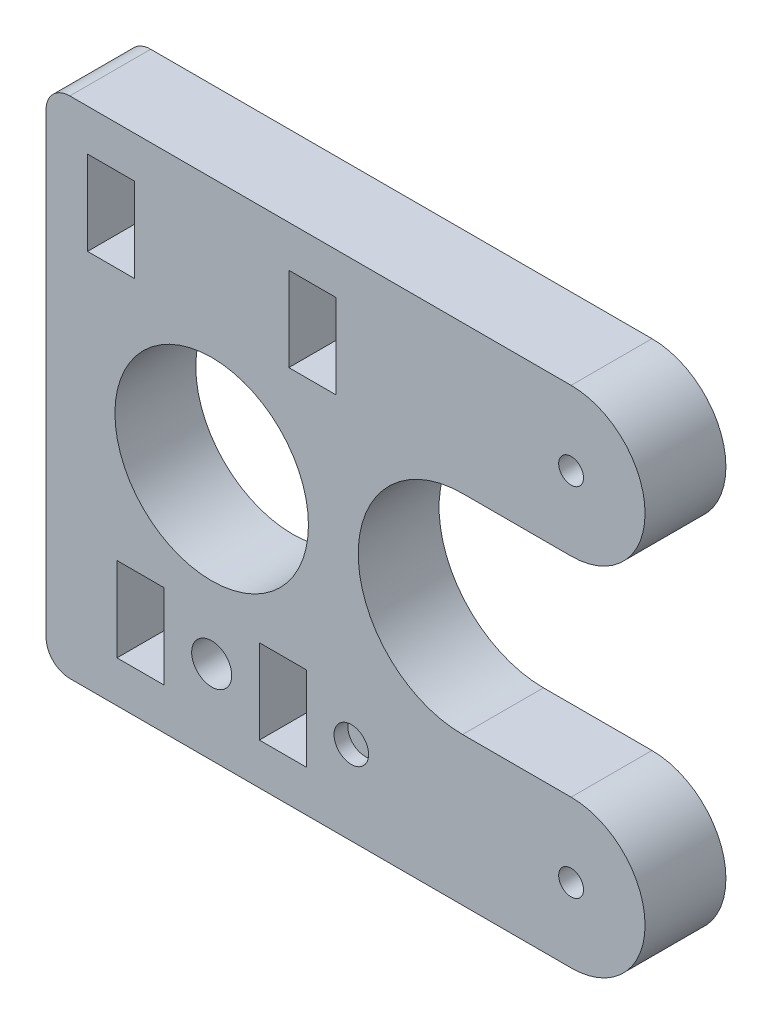
ISO-10303-21;
HEADER;
FILE_DESCRIPTION(('STEP AP214'),'2;1');
FILE_NAME('part.step','',(''),(''),'','','');
FILE_SCHEMA(('AUTOMOTIVE_DESIGN { 1 0 10303 214 1 1 1 1 }'));
ENDSEC;
DATA;
#1=APPLICATION_CONTEXT('core data for automotive mechanical design processes');
#2=APPLICATION_PROTOCOL_DEFINITION('international standard','automotive_design',2000,#1);
#3=PRODUCT_CONTEXT('',#1,'mechanical');
#4=PRODUCT('Part','Part','',(#3));
#5=PRODUCT_RELATED_PRODUCT_CATEGORY('part','',(#4));
#6=PRODUCT_DEFINITION_FORMATION('','',#4);
#7=PRODUCT_DEFINITION_CONTEXT('part definition',#1,'design');
#8=PRODUCT_DEFINITION('design','',#6,#7);
#9=PRODUCT_DEFINITION_SHAPE('','',#8);
#10=(LENGTH_UNIT() NAMED_UNIT(*) SI_UNIT(.MILLI.,.METRE.));
#11=(NAMED_UNIT(*) PLANE_ANGLE_UNIT() SI_UNIT($,.RADIAN.));
#12=(NAMED_UNIT(*) SI_UNIT($,.STERADIAN.) SOLID_ANGLE_UNIT());
#13=UNCERTAINTY_MEASURE_WITH_UNIT(LENGTH_MEASURE(1.E-05),#10,'distance_accuracy_value','');
#14=(GEOMETRIC_REPRESENTATION_CONTEXT(3) GLOBAL_UNCERTAINTY_ASSIGNED_CONTEXT((#13)) GLOBAL_UNIT_ASSIGNED_CONTEXT((#10,
#11,#12)) REPRESENTATION_CONTEXT('',''));
#15=CARTESIAN_POINT('',(0.,0.,0.));
#16=DIRECTION('',(0.,0.,1.));
#17=DIRECTION('',(1.,0.,0.));
#18=AXIS2_PLACEMENT_3D('',#15,#16,#17);
#19=CARTESIAN_POINT('',(684.72652137136,317.86545660983,5.85));
#20=DIRECTION('',(0.,0.,1.));
#21=DIRECTION('',(1.,0.,0.));
#22=AXIS2_PLACEMENT_3D('',#19,#20,#21);
#23=PLANE('',#22);
#24=CARTESIAN_POINT('',(668.82652137136,318.56545660983,5.85));
#25=DIRECTION('',(0.,0.,1.));
#26=DIRECTION('',(1.,0.,0.));
#27=AXIS2_PLACEMENT_3D('',#24,#25,#26);
#28=CIRCLE('',#27,1.24999999999996);
#29=CARTESIAN_POINT('',(670.07652137136,318.56545660983,5.85));
#30=VERTEX_POINT('',#29);
#31=EDGE_CURVE('E801',#30,#30,#28,.T.);
#32=ORIENTED_EDGE('',*,*,#31,.F.);
#33=EDGE_LOOP('',(#32));
#34=FACE_BOUND('',#33,.T.);
#35=DIRECTION('',(0.,1.,0.));
#36=VECTOR('',#35,1.);
#37=CARTESIAN_POINT('',(667.70653237136,339.91545660983,5.85));
#38=LINE('',#37,#36);
#39=CARTESIAN_POINT('',(667.70653237136,339.91545660983,5.85));
#40=VERTEX_POINT('',#39);
#41=CARTESIAN_POINT('',(667.70653237136,346.01545660983,5.85));
#42=VERTEX_POINT('',#41);
#43=EDGE_CURVE('E248',#40,#42,#38,.T.);
#44=ORIENTED_EDGE('',*,*,#43,.F.);
#45=DIRECTION('',(1.,0.,0.));
#46=VECTOR('',#45,1.);
#47=CARTESIAN_POINT('',(664.30652137136,339.91545660983,5.85));
#48=LINE('',#47,#46);
#49=CARTESIAN_POINT('',(664.30652137136,339.91545660983,5.85));
#50=VERTEX_POINT('',#49);
#51=EDGE_CURVE('E246',#50,#40,#48,.T.);
#52=ORIENTED_EDGE('',*,*,#51,.F.);
#53=DIRECTION('',(0.,-1.,0.));
#54=VECTOR('',#53,1.);
#55=CARTESIAN_POINT('',(664.30652137136,346.01545660983,5.85));
#56=LINE('',#55,#54);
#57=CARTESIAN_POINT('',(664.30652137136,346.01545660983,5.85));
#58=VERTEX_POINT('',#57);
#59=EDGE_CURVE('E254',#58,#50,#56,.T.);
#60=ORIENTED_EDGE('',*,*,#59,.F.);
#61=DIRECTION('',(-1.,0.,0.));
#62=VECTOR('',#61,1.);
#63=CARTESIAN_POINT('',(667.70653237136,346.01545660983,5.85));
#64=LINE('',#63,#62);
#65=EDGE_CURVE('E251',#42,#58,#64,.T.);
#66=ORIENTED_EDGE('',*,*,#65,.F.);
#67=EDGE_LOOP('',(#44,#52,#60,#66));
#68=FACE_BOUND('',#67,.T.);
#69=DIRECTION('',(0.,1.,0.));
#70=VECTOR('',#69,1.);
#71=CARTESIAN_POINT('',(653.14652137136,339.91545660983,5.85));
#72=LINE('',#71,#70);
#73=CARTESIAN_POINT('',(653.14652137136,339.91545660983,5.85));
#74=VERTEX_POINT('',#73);
#75=CARTESIAN_POINT('',(653.14652137136,346.01545660983,5.85));
#76=VERTEX_POINT('',#75);
#77=EDGE_CURVE('E310',#74,#76,#72,.T.);
#78=ORIENTED_EDGE('',*,*,#77,.F.);
#79=DIRECTION('',(1.,0.,0.));
#80=VECTOR('',#79,1.);
#81=CARTESIAN_POINT('',(649.74651037136,339.91545660983,5.85));
#82=LINE('',#81,#80);
#83=CARTESIAN_POINT('',(649.74651037136,339.91545660983,5.85));
#84=VERTEX_POINT('',#83);
#85=EDGE_CURVE('E308',#84,#74,#82,.T.);
#86=ORIENTED_EDGE('',*,*,#85,.F.);
#87=DIRECTION('',(0.,-1.,0.));
#88=VECTOR('',#87,1.);
#89=CARTESIAN_POINT('',(649.74651037136,346.01545660983,5.85));
#90=LINE('',#89,#88);
#91=CARTESIAN_POINT('',(649.74651037136,346.01545660983,5.85));
#92=VERTEX_POINT('',#91);
#93=EDGE_CURVE('E316',#92,#84,#90,.T.);
#94=ORIENTED_EDGE('',*,*,#93,.F.);
#95=DIRECTION('',(-1.,0.,0.));
#96=VECTOR('',#95,1.);
#97=CARTESIAN_POINT('',(653.14652137136,346.01545660983,5.85));
#98=LINE('',#97,#96);
#99=EDGE_CURVE('E313',#76,#92,#98,.T.);
#100=ORIENTED_EDGE('',*,*,#99,.F.);
#101=EDGE_LOOP('',(#78,#86,#94,#100));
#102=FACE_BOUND('',#101,.T.);
#103=CARTESIAN_POINT('',(658.72652137136,330.76545660983,5.85));
#104=DIRECTION('',(0.,0.,1.));
#105=DIRECTION('',(1.,0.,0.));
#106=AXIS2_PLACEMENT_3D('',#103,#104,#105);
#107=CIRCLE('',#106,7.00000000000004);
#108=CARTESIAN_POINT('',(665.72652137136,330.76545660983,5.85));
#109=VERTEX_POINT('',#108);
#110=EDGE_CURVE('E345',#109,#109,#107,.T.);
#111=ORIENTED_EDGE('',*,*,#110,.F.);
#112=EDGE_LOOP('',(#111));
#113=FACE_BOUND('',#112,.T.);
#114=CARTESIAN_POINT('',(684.72652137136,343.66545660983,5.85));
#115=DIRECTION('',(0.,0.,1.));
#116=DIRECTION('',(1.,0.,0.));
#117=AXIS2_PLACEMENT_3D('',#114,#115,#116);
#118=CIRCLE('',#117,0.900000000000007);
#119=CARTESIAN_POINT('',(685.62652137136,343.66545660983,5.85));
#120=VERTEX_POINT('',#119);
#121=EDGE_CURVE('E357',#120,#120,#118,.T.);
#122=ORIENTED_EDGE('',*,*,#121,.F.);
#123=EDGE_LOOP('',(#122));
#124=FACE_BOUND('',#123,.T.);
#125=DIRECTION('',(1.,0.,0.));
#126=VECTOR('',#125,1.);
#127=CARTESIAN_POINT('',(669.216844170212,312.51545660983,5.85));
#128=LINE('',#127,#126);
#129=CARTESIAN_POINT('',(648.463811899796,312.51545660983,5.85));
#130=VERTEX_POINT('',#129);
#131=CARTESIAN_POINT('',(684.726521371375,312.51545660983,5.85));
#132=VERTEX_POINT('',#131);
#133=EDGE_CURVE('E363',#130,#132,#128,.T.);
#134=ORIENTED_EDGE('',*,*,#133,.T.);
#135=CARTESIAN_POINT('',(684.72652137136,317.86545660983,5.85));
#136=DIRECTION('',(0.,0.,1.));
#137=DIRECTION('',(1.,0.,0.));
#138=AXIS2_PLACEMENT_3D('',#135,#136,#137);
#139=CIRCLE('',#138,5.34999999999997);
#140=CARTESIAN_POINT('',(684.726521371376,323.21545660983,5.85));
#141=VERTEX_POINT('',#140);
#142=EDGE_CURVE('E366',#132,#141,#139,.T.);
#143=ORIENTED_EDGE('',*,*,#142,.T.);
#144=DIRECTION('',(-1.,0.,0.));
#145=VECTOR('',#144,1.);
#146=CARTESIAN_POINT('',(684.726521371376,323.21545660983,5.85));
#147=LINE('',#146,#145);
#148=CARTESIAN_POINT('',(676.876521371359,323.21545660983,5.85));
#149=VERTEX_POINT('',#148);
#150=EDGE_CURVE('E369',#141,#149,#147,.T.);
#151=ORIENTED_EDGE('',*,*,#150,.T.);
#152=CARTESIAN_POINT('',(676.876521371359,330.76545660983,5.85));
#153=DIRECTION('',(0.,0.,-1.));
#154=DIRECTION('',(1.,0.,0.));
#155=AXIS2_PLACEMENT_3D('',#152,#153,#154);
#156=CIRCLE('',#155,7.55);
#157=CARTESIAN_POINT('',(676.876521371359,338.31545660983,5.85));
#158=VERTEX_POINT('',#157);
#159=EDGE_CURVE('E371',#149,#158,#156,.T.);
#160=ORIENTED_EDGE('',*,*,#159,.T.);
#161=DIRECTION('',(1.,0.,0.));
#162=VECTOR('',#161,1.);
#163=CARTESIAN_POINT('',(684.726521371376,338.31545660983,5.85));
#164=LINE('',#163,#162);
#165=CARTESIAN_POINT('',(684.726521371376,338.31545660983,5.85));
#166=VERTEX_POINT('',#165);
#167=EDGE_CURVE('E373',#158,#166,#164,.T.);
#168=ORIENTED_EDGE('',*,*,#167,.T.);
#169=CARTESIAN_POINT('',(684.72652137136,343.66545660983,5.85));
#170=DIRECTION('',(0.,0.,1.));
#171=DIRECTION('',(-1.,0.,0.));
#172=AXIS2_PLACEMENT_3D('',#169,#170,#171);
#173=CIRCLE('',#172,5.34999999999997);
#174=CARTESIAN_POINT('',(684.726521371375,349.01545660983,5.85));
#175=VERTEX_POINT('',#174);
#176=EDGE_CURVE('E375',#166,#175,#173,.T.);
#177=ORIENTED_EDGE('',*,*,#176,.T.);
#178=DIRECTION('',(-1.,0.,0.));
#179=VECTOR('',#178,1.);
#180=CARTESIAN_POINT('',(669.21684417021,349.01545660983,5.85));
#181=LINE('',#180,#179);
#182=CARTESIAN_POINT('',(648.463811899796,349.01545660983,5.85));
#183=VERTEX_POINT('',#182);
#184=EDGE_CURVE('E377',#175,#183,#181,.T.);
#185=ORIENTED_EDGE('',*,*,#184,.T.);
#186=CARTESIAN_POINT('',(648.463811899796,347.298155081394,5.85));
#187=DIRECTION('',(0.,0.,1.));
#188=DIRECTION('',(1.,0.,0.));
#189=AXIS2_PLACEMENT_3D('',#186,#187,#188);
#190=CIRCLE('',#189,1.71730152843574);
#191=CARTESIAN_POINT('',(646.74651037136,347.298155081394,5.85));
#192=VERTEX_POINT('',#191);
#193=EDGE_CURVE('E379',#183,#192,#190,.T.);
#194=ORIENTED_EDGE('',*,*,#193,.T.);
#195=DIRECTION('',(0.,-1.,0.));
#196=VECTOR('',#195,1.);
#197=CARTESIAN_POINT('',(646.74651037136,347.298155081394,5.85));
#198=LINE('',#197,#196);
#199=CARTESIAN_POINT('',(646.74651037136,314.232758138266,5.85));
#200=VERTEX_POINT('',#199);
#201=EDGE_CURVE('E381',#192,#200,#198,.T.);
#202=ORIENTED_EDGE('',*,*,#201,.T.);
#203=CARTESIAN_POINT('',(648.463811899796,314.232758138266,5.85));
#204=DIRECTION('',(0.,0.,1.));
#205=DIRECTION('',(1.,0.,0.));
#206=AXIS2_PLACEMENT_3D('',#203,#204,#205);
#207=CIRCLE('',#206,1.71730152843574);
#208=EDGE_CURVE('E383',#200,#130,#207,.T.);
#209=ORIENTED_EDGE('',*,*,#208,.T.);
#210=EDGE_LOOP('',(#134,#143,#151,#160,#168,#177,#185,#194,#202,#209));
#211=FACE_BOUND('',#210,.T.);
#212=CARTESIAN_POINT('',(658.72652137136,318.56545660983,5.85));
#213=DIRECTION('',(0.,0.,1.));
#214=DIRECTION('',(1.,0.,0.));
#215=AXIS2_PLACEMENT_3D('',#212,#213,#214);
#216=CIRCLE('',#215,1.44999999999994);
#217=CARTESIAN_POINT('',(660.17652137136,318.56545660983,5.85));
#218=VERTEX_POINT('',#217);
#219=EDGE_CURVE('E351',#218,#218,#216,.T.);
#220=ORIENTED_EDGE('',*,*,#219,.F.);
#221=EDGE_LOOP('',(#220));
#222=FACE_BOUND('',#221,.T.);
#223=CARTESIAN_POINT('',(684.72652137136,317.86545660983,5.85));
#224=DIRECTION('',(0.,0.,1.));
#225=DIRECTION('',(1.,0.,0.));
#226=AXIS2_PLACEMENT_3D('',#223,#224,#225);
#227=CIRCLE('',#226,0.900000000000007);
#228=CARTESIAN_POINT('',(685.62652137136,317.86545660983,5.85));
#229=VERTEX_POINT('',#228);
#230=EDGE_CURVE('E339',#229,#229,#227,.T.);
#231=ORIENTED_EDGE('',*,*,#230,.F.);
#232=EDGE_LOOP('',(#231));
#233=FACE_BOUND('',#232,.T.);
#234=DIRECTION('',(1.,0.,0.));
#235=VECTOR('',#234,1.);
#236=CARTESIAN_POINT('',(651.876521371361,315.51545660983,5.85));
#237=LINE('',#236,#235);
#238=CARTESIAN_POINT('',(651.876521371361,315.51545660983,5.85));
#239=VERTEX_POINT('',#238);
#240=CARTESIAN_POINT('',(655.27652137136,315.51545660983,5.85));
#241=VERTEX_POINT('',#240);
#242=EDGE_CURVE('E279',#239,#241,#237,.T.);
#243=ORIENTED_EDGE('',*,*,#242,.F.);
#244=DIRECTION('',(0.,-1.,0.));
#245=VECTOR('',#244,1.);
#246=CARTESIAN_POINT('',(651.876521371361,321.61545660983,5.85));
#247=LINE('',#246,#245);
#248=CARTESIAN_POINT('',(651.876521371361,321.61545660983,5.85));
#249=VERTEX_POINT('',#248);
#250=EDGE_CURVE('E277',#249,#239,#247,.T.);
#251=ORIENTED_EDGE('',*,*,#250,.F.);
#252=DIRECTION('',(-1.,0.,0.));
#253=VECTOR('',#252,1.);
#254=CARTESIAN_POINT('',(655.27652137136,321.61545660983,5.85));
#255=LINE('',#254,#253);
#256=CARTESIAN_POINT('',(655.27652137136,321.61545660983,5.85));
#257=VERTEX_POINT('',#256);
#258=EDGE_CURVE('E285',#257,#249,#255,.T.);
#259=ORIENTED_EDGE('',*,*,#258,.F.);
#260=DIRECTION('',(0.,1.,0.));
#261=VECTOR('',#260,1.);
#262=CARTESIAN_POINT('',(655.27652137136,315.51545660983,5.85));
#263=LINE('',#262,#261);
#264=EDGE_CURVE('E282',#241,#257,#263,.T.);
#265=ORIENTED_EDGE('',*,*,#264,.F.);
#266=EDGE_LOOP('',(#243,#251,#259,#265));
#267=FACE_BOUND('',#266,.T.);
#268=DIRECTION('',(0.,-1.,0.));
#269=VECTOR('',#268,1.);
#270=CARTESIAN_POINT('',(662.17652137136,321.61545660983,5.85));
#271=LINE('',#270,#269);
#272=CARTESIAN_POINT('',(662.17652137136,321.61545660983,5.85));
#273=VERTEX_POINT('',#272);
#274=CARTESIAN_POINT('',(662.17652137136,315.51545660983,5.85));
#275=VERTEX_POINT('',#274);
#276=EDGE_CURVE('E216',#273,#275,#271,.T.);
#277=ORIENTED_EDGE('',*,*,#276,.F.);
#278=DIRECTION('',(-1.,0.,0.));
#279=VECTOR('',#278,1.);
#280=CARTESIAN_POINT('',(665.57652137136,321.61545660983,5.85));
#281=LINE('',#280,#279);
#282=CARTESIAN_POINT('',(665.57652137136,321.61545660983,5.85));
#283=VERTEX_POINT('',#282);
#284=EDGE_CURVE('E208',#283,#273,#281,.T.);
#285=ORIENTED_EDGE('',*,*,#284,.F.);
#286=DIRECTION('',(0.,1.,0.));
#287=VECTOR('',#286,1.);
#288=CARTESIAN_POINT('',(665.57652137136,315.51545660983,5.85));
#289=LINE('',#288,#287);
#290=CARTESIAN_POINT('',(665.57652137136,315.51545660983,5.85));
#291=VERTEX_POINT('',#290);
#292=EDGE_CURVE('E230',#291,#283,#289,.T.);
#293=ORIENTED_EDGE('',*,*,#292,.F.);
#294=DIRECTION('',(1.,0.,0.));
#295=VECTOR('',#294,1.);
#296=CARTESIAN_POINT('',(662.17652137136,315.51545660983,5.85));
#297=LINE('',#296,#295);
#298=EDGE_CURVE('E228',#275,#291,#297,.T.);
#299=ORIENTED_EDGE('',*,*,#298,.F.);
#300=EDGE_LOOP('',(#277,#285,#293,#299));
#301=FACE_BOUND('',#300,.T.);
#302=ADVANCED_FACE('F35',(#34,#68,#102,#113,#124,#211,#222,#233,#267,#301),#23,.T.);
#303=CARTESIAN_POINT('',(684.72652137136,317.86545660983,0.));
#304=DIRECTION('',(0.,0.,1.));
#305=DIRECTION('',(1.,0.,0.));
#306=AXIS2_PLACEMENT_3D('',#303,#304,#305);
#307=PLANE('',#306);
#308=DIRECTION('',(1.,0.,0.));
#309=VECTOR('',#308,1.);
#310=CARTESIAN_POINT('',(664.30652137136,339.91545660983,0.));
#311=LINE('',#310,#309);
#312=CARTESIAN_POINT('',(664.30652137136,339.91545660983,0.));
#313=VERTEX_POINT('',#312);
#314=CARTESIAN_POINT('',(667.70653237136,339.91545660983,0.));
#315=VERTEX_POINT('',#314);
#316=EDGE_CURVE('E224',#313,#315,#311,.T.);
#317=ORIENTED_EDGE('',*,*,#316,.T.);
#318=DIRECTION('',(0.,1.,0.));
#319=VECTOR('',#318,1.);
#320=CARTESIAN_POINT('',(667.70653237136,339.91545660983,0.));
#321=LINE('',#320,#319);
#322=CARTESIAN_POINT('',(667.70653237136,346.01545660983,0.));
#323=VERTEX_POINT('',#322);
#324=EDGE_CURVE('E259',#315,#323,#321,.T.);
#325=ORIENTED_EDGE('',*,*,#324,.T.);
#326=DIRECTION('',(-1.,0.,0.));
#327=VECTOR('',#326,1.);
#328=CARTESIAN_POINT('',(667.70653237136,346.01545660983,0.));
#329=LINE('',#328,#327);
#330=CARTESIAN_POINT('',(664.30652137136,346.01545660983,0.));
#331=VERTEX_POINT('',#330);
#332=EDGE_CURVE('E262',#323,#331,#329,.T.);
#333=ORIENTED_EDGE('',*,*,#332,.T.);
#334=DIRECTION('',(0.,-1.,0.));
#335=VECTOR('',#334,1.);
#336=CARTESIAN_POINT('',(664.30652137136,346.01545660983,0.));
#337=LINE('',#336,#335);
#338=EDGE_CURVE('E249',#331,#313,#337,.T.);
#339=ORIENTED_EDGE('',*,*,#338,.T.);
#340=EDGE_LOOP('',(#317,#325,#333,#339));
#341=FACE_BOUND('',#340,.T.);
#342=DIRECTION('',(1.,0.,0.));
#343=VECTOR('',#342,1.);
#344=CARTESIAN_POINT('',(649.74651037136,339.91545660983,0.));
#345=LINE('',#344,#343);
#346=CARTESIAN_POINT('',(649.74651037136,339.91545660983,0.));
#347=VERTEX_POINT('',#346);
#348=CARTESIAN_POINT('',(653.14652137136,339.91545660983,0.));
#349=VERTEX_POINT('',#348);
#350=EDGE_CURVE('E307',#347,#349,#345,.T.);
#351=ORIENTED_EDGE('',*,*,#350,.T.);
#352=DIRECTION('',(0.,1.,0.));
#353=VECTOR('',#352,1.);
#354=CARTESIAN_POINT('',(653.14652137136,339.91545660983,0.));
#355=LINE('',#354,#353);
#356=CARTESIAN_POINT('',(653.14652137136,346.01545660983,0.));
#357=VERTEX_POINT('',#356);
#358=EDGE_CURVE('E321',#349,#357,#355,.T.);
#359=ORIENTED_EDGE('',*,*,#358,.T.);
#360=DIRECTION('',(-1.,0.,0.));
#361=VECTOR('',#360,1.);
#362=CARTESIAN_POINT('',(653.14652137136,346.01545660983,0.));
#363=LINE('',#362,#361);
#364=CARTESIAN_POINT('',(649.74651037136,346.01545660983,0.));
#365=VERTEX_POINT('',#364);
#366=EDGE_CURVE('E324',#357,#365,#363,.T.);
#367=ORIENTED_EDGE('',*,*,#366,.T.);
#368=DIRECTION('',(0.,-1.,0.));
#369=VECTOR('',#368,1.);
#370=CARTESIAN_POINT('',(649.74651037136,346.01545660983,0.));
#371=LINE('',#370,#369);
#372=EDGE_CURVE('E311',#365,#347,#371,.T.);
#373=ORIENTED_EDGE('',*,*,#372,.T.);
#374=EDGE_LOOP('',(#351,#359,#367,#373));
#375=FACE_BOUND('',#374,.T.);
#376=CARTESIAN_POINT('',(658.72652137136,330.76545660983,0.));
#377=DIRECTION('',(0.,0.,1.));
#378=DIRECTION('',(1.,0.,0.));
#379=AXIS2_PLACEMENT_3D('',#376,#377,#378);
#380=CIRCLE('',#379,7.00000000000004);
#381=CARTESIAN_POINT('',(665.72652137136,330.76545660983,0.));
#382=VERTEX_POINT('',#381);
#383=EDGE_CURVE('E342',#382,#382,#380,.T.);
#384=ORIENTED_EDGE('',*,*,#383,.T.);
#385=EDGE_LOOP('',(#384));
#386=FACE_BOUND('',#385,.T.);
#387=CARTESIAN_POINT('',(684.72652137136,343.66545660983,0.));
#388=DIRECTION('',(0.,0.,1.));
#389=DIRECTION('',(1.,0.,0.));
#390=AXIS2_PLACEMENT_3D('',#387,#388,#389);
#391=CIRCLE('',#390,0.900000000000007);
#392=CARTESIAN_POINT('',(685.62652137136,343.66545660983,0.));
#393=VERTEX_POINT('',#392);
#394=EDGE_CURVE('E354',#393,#393,#391,.T.);
#395=ORIENTED_EDGE('',*,*,#394,.T.);
#396=EDGE_LOOP('',(#395));
#397=FACE_BOUND('',#396,.T.);
#398=CARTESIAN_POINT('',(684.72652137136,317.86545660983,0.));
#399=DIRECTION('',(0.,0.,1.));
#400=DIRECTION('',(1.,0.,0.));
#401=AXIS2_PLACEMENT_3D('',#398,#399,#400);
#402=CIRCLE('',#401,5.34999999999997);
#403=CARTESIAN_POINT('',(684.726521371375,312.51545660983,0.));
#404=VERTEX_POINT('',#403);
#405=CARTESIAN_POINT('',(684.726521371376,323.21545660983,0.));
#406=VERTEX_POINT('',#405);
#407=EDGE_CURVE('E360',#404,#406,#402,.T.);
#408=ORIENTED_EDGE('',*,*,#407,.F.);
#409=DIRECTION('',(1.,0.,0.));
#410=VECTOR('',#409,1.);
#411=CARTESIAN_POINT('',(648.463811899796,312.51545660983,0.));
#412=LINE('',#411,#410);
#413=CARTESIAN_POINT('',(648.463811899796,312.51545660983,0.));
#414=VERTEX_POINT('',#413);
#415=EDGE_CURVE('E367',#414,#404,#412,.T.);
#416=ORIENTED_EDGE('',*,*,#415,.F.);
#417=CARTESIAN_POINT('',(648.463811899796,314.232758138266,0.));
#418=DIRECTION('',(0.,0.,1.));
#419=DIRECTION('',(1.,0.,0.));
#420=AXIS2_PLACEMENT_3D('',#417,#418,#419);
#421=CIRCLE('',#420,1.71730152843574);
#422=CARTESIAN_POINT('',(646.74651037136,314.232758138266,0.));
#423=VERTEX_POINT('',#422);
#424=EDGE_CURVE('E403',#423,#414,#421,.T.);
#425=ORIENTED_EDGE('',*,*,#424,.F.);
#426=DIRECTION('',(0.,-1.,0.));
#427=VECTOR('',#426,1.);
#428=CARTESIAN_POINT('',(646.74651037136,347.298155081394,0.));
#429=LINE('',#428,#427);
#430=CARTESIAN_POINT('',(646.74651037136,347.298155081394,0.));
#431=VERTEX_POINT('',#430);
#432=EDGE_CURVE('E401',#431,#423,#429,.T.);
#433=ORIENTED_EDGE('',*,*,#432,.F.);
#434=CARTESIAN_POINT('',(648.463811899796,347.298155081394,0.));
#435=DIRECTION('',(0.,0.,1.));
#436=DIRECTION('',(1.,0.,0.));
#437=AXIS2_PLACEMENT_3D('',#434,#435,#436);
#438=CIRCLE('',#437,1.71730152843574);
#439=CARTESIAN_POINT('',(648.463811899796,349.01545660983,0.));
#440=VERTEX_POINT('',#439);
#441=EDGE_CURVE('E399',#440,#431,#438,.T.);
#442=ORIENTED_EDGE('',*,*,#441,.F.);
#443=DIRECTION('',(-1.,0.,0.));
#444=VECTOR('',#443,1.);
#445=CARTESIAN_POINT('',(669.21684417021,349.01545660983,0.));
#446=LINE('',#445,#444);
#447=CARTESIAN_POINT('',(684.726521371375,349.01545660983,0.));
#448=VERTEX_POINT('',#447);
#449=EDGE_CURVE('E397',#448,#440,#446,.T.);
#450=ORIENTED_EDGE('',*,*,#449,.F.);
#451=CARTESIAN_POINT('',(684.72652137136,343.66545660983,0.));
#452=DIRECTION('',(0.,0.,1.));
#453=DIRECTION('',(-1.,0.,0.));
#454=AXIS2_PLACEMENT_3D('',#451,#452,#453);
#455=CIRCLE('',#454,5.34999999999997);
#456=CARTESIAN_POINT('',(684.726521371376,338.31545660983,0.));
#457=VERTEX_POINT('',#456);
#458=EDGE_CURVE('E394',#457,#448,#455,.T.);
#459=ORIENTED_EDGE('',*,*,#458,.F.);
#460=DIRECTION('',(1.,0.,0.));
#461=VECTOR('',#460,1.);
#462=CARTESIAN_POINT('',(684.726521371376,338.31545660983,0.));
#463=LINE('',#462,#461);
#464=CARTESIAN_POINT('',(676.876521371359,338.31545660983,0.));
#465=VERTEX_POINT('',#464);
#466=EDGE_CURVE('E392',#465,#457,#463,.T.);
#467=ORIENTED_EDGE('',*,*,#466,.F.);
#468=CARTESIAN_POINT('',(676.876521371359,330.76545660983,0.));
#469=DIRECTION('',(0.,0.,-1.));
#470=DIRECTION('',(1.,0.,0.));
#471=AXIS2_PLACEMENT_3D('',#468,#469,#470);
#472=CIRCLE('',#471,7.55);
#473=CARTESIAN_POINT('',(676.876521371359,323.21545660983,0.));
#474=VERTEX_POINT('',#473);
#475=EDGE_CURVE('E390',#474,#465,#472,.T.);
#476=ORIENTED_EDGE('',*,*,#475,.F.);
#477=DIRECTION('',(-1.,0.,0.));
#478=VECTOR('',#477,1.);
#479=CARTESIAN_POINT('',(684.726521371376,323.21545660983,0.));
#480=LINE('',#479,#478);
#481=EDGE_CURVE('E388',#406,#474,#480,.T.);
#482=ORIENTED_EDGE('',*,*,#481,.F.);
#483=EDGE_LOOP('',(#408,#416,#425,#433,#442,#450,#459,#467,#476,#482));
#484=FACE_BOUND('',#483,.T.);
#485=CARTESIAN_POINT('',(658.72652137136,318.56545660983,0.));
#486=DIRECTION('',(0.,0.,1.));
#487=DIRECTION('',(1.,0.,0.));
#488=AXIS2_PLACEMENT_3D('',#485,#486,#487);
#489=CIRCLE('',#488,1.44999999999994);
#490=CARTESIAN_POINT('',(660.17652137136,318.56545660983,0.));
#491=VERTEX_POINT('',#490);
#492=EDGE_CURVE('E348',#491,#491,#489,.T.);
#493=ORIENTED_EDGE('',*,*,#492,.T.);
#494=EDGE_LOOP('',(#493));
#495=FACE_BOUND('',#494,.T.);
#496=CARTESIAN_POINT('',(684.72652137136,317.86545660983,0.));
#497=DIRECTION('',(0.,0.,1.));
#498=DIRECTION('',(1.,0.,0.));
#499=AXIS2_PLACEMENT_3D('',#496,#497,#498);
#500=CIRCLE('',#499,0.900000000000007);
#501=CARTESIAN_POINT('',(685.62652137136,317.86545660983,0.));
#502=VERTEX_POINT('',#501);
#503=EDGE_CURVE('E338',#502,#502,#500,.T.);
#504=ORIENTED_EDGE('',*,*,#503,.T.);
#505=EDGE_LOOP('',(#504));
#506=FACE_BOUND('',#505,.T.);
#507=DIRECTION('',(0.,-1.,0.));
#508=VECTOR('',#507,1.);
#509=CARTESIAN_POINT('',(651.876521371361,321.61545660983,0.));
#510=LINE('',#509,#508);
#511=CARTESIAN_POINT('',(651.876521371361,321.61545660983,0.));
#512=VERTEX_POINT('',#511);
#513=CARTESIAN_POINT('',(651.876521371361,315.51545660983,0.));
#514=VERTEX_POINT('',#513);
#515=EDGE_CURVE('E276',#512,#514,#510,.T.);
#516=ORIENTED_EDGE('',*,*,#515,.T.);
#517=DIRECTION('',(1.,0.,0.));
#518=VECTOR('',#517,1.);
#519=CARTESIAN_POINT('',(651.876521371361,315.51545660983,0.));
#520=LINE('',#519,#518);
#521=CARTESIAN_POINT('',(655.27652137136,315.51545660983,0.));
#522=VERTEX_POINT('',#521);
#523=EDGE_CURVE('E290',#514,#522,#520,.T.);
#524=ORIENTED_EDGE('',*,*,#523,.T.);
#525=DIRECTION('',(0.,1.,0.));
#526=VECTOR('',#525,1.);
#527=CARTESIAN_POINT('',(655.27652137136,315.51545660983,0.));
#528=LINE('',#527,#526);
#529=CARTESIAN_POINT('',(655.27652137136,321.61545660983,0.));
#530=VERTEX_POINT('',#529);
#531=EDGE_CURVE('E293',#522,#530,#528,.T.);
#532=ORIENTED_EDGE('',*,*,#531,.T.);
#533=DIRECTION('',(-1.,0.,0.));
#534=VECTOR('',#533,1.);
#535=CARTESIAN_POINT('',(655.27652137136,321.61545660983,0.));
#536=LINE('',#535,#534);
#537=EDGE_CURVE('E280',#530,#512,#536,.T.);
#538=ORIENTED_EDGE('',*,*,#537,.T.);
#539=EDGE_LOOP('',(#516,#524,#532,#538));
#540=FACE_BOUND('',#539,.T.);
#541=DIRECTION('',(-1.,0.,0.));
#542=VECTOR('',#541,1.);
#543=CARTESIAN_POINT('',(665.57652137136,321.61545660983,0.));
#544=LINE('',#543,#542);
#545=CARTESIAN_POINT('',(665.57652137136,321.61545660983,0.));
#546=VERTEX_POINT('',#545);
#547=CARTESIAN_POINT('',(662.17652137136,321.61545660983,0.));
#548=VERTEX_POINT('',#547);
#549=EDGE_CURVE('E58',#546,#548,#544,.T.);
#550=ORIENTED_EDGE('',*,*,#549,.T.);
#551=DIRECTION('',(0.,-1.,0.));
#552=VECTOR('',#551,1.);
#553=CARTESIAN_POINT('',(662.17652137136,321.61545660983,0.));
#554=LINE('',#553,#552);
#555=CARTESIAN_POINT('',(662.17652137136,315.51545660983,0.));
#556=VERTEX_POINT('',#555);
#557=EDGE_CURVE('E223',#548,#556,#554,.T.);
#558=ORIENTED_EDGE('',*,*,#557,.T.);
#559=DIRECTION('',(1.,0.,0.));
#560=VECTOR('',#559,1.);
#561=CARTESIAN_POINT('',(662.17652137136,315.51545660983,0.));
#562=LINE('',#561,#560);
#563=CARTESIAN_POINT('',(665.57652137136,315.51545660983,0.));
#564=VERTEX_POINT('',#563);
#565=EDGE_CURVE('E238',#556,#564,#562,.T.);
#566=ORIENTED_EDGE('',*,*,#565,.T.);
#567=DIRECTION('',(0.,1.,0.));
#568=VECTOR('',#567,1.);
#569=CARTESIAN_POINT('',(665.57652137136,315.51545660983,0.));
#570=LINE('',#569,#568);
#571=EDGE_CURVE('E217',#564,#546,#570,.T.);
#572=ORIENTED_EDGE('',*,*,#571,.T.);
#573=EDGE_LOOP('',(#550,#558,#566,#572));
#574=FACE_BOUND('',#573,.T.);
#575=ADVANCED_FACE('F439',(#341,#375,#386,#397,#484,#495,#506,#540,#574),#307,.F.);
#576=CARTESIAN_POINT('',(684.72652137136,317.86545660983,5.85));
#577=DIRECTION('',(0.,0.,-1.));
#578=DIRECTION('',(-1.,0.,0.));
#579=AXIS2_PLACEMENT_3D('',#576,#577,#578);
#580=CYLINDRICAL_SURFACE('',#579,5.34999999999997);
#581=ORIENTED_EDGE('',*,*,#407,.T.);
#582=DIRECTION('',(0.,0.,-1.));
#583=VECTOR('',#582,1.);
#584=CARTESIAN_POINT('',(684.726521371376,323.21545660983,5.85));
#585=LINE('',#584,#583);
#586=EDGE_CURVE('E43',#141,#406,#585,.T.);
#587=ORIENTED_EDGE('',*,*,#586,.F.);
#588=ORIENTED_EDGE('',*,*,#142,.F.);
#589=DIRECTION('',(0.,0.,-1.));
#590=VECTOR('',#589,1.);
#591=CARTESIAN_POINT('',(684.726521371375,312.51545660983,5.85));
#592=LINE('',#591,#590);
#593=EDGE_CURVE('E11',#132,#404,#592,.T.);
#594=ORIENTED_EDGE('',*,*,#593,.T.);
#595=EDGE_LOOP('',(#581,#587,#588,#594));
#596=FACE_BOUND('',#595,.T.);
#597=ADVANCED_FACE('F37',(#596),#580,.T.);
#598=CARTESIAN_POINT('',(684.726521371376,323.21545660983,5.85));
#599=DIRECTION('',(0.,-1.,0.));
#600=DIRECTION('',(1.,0.,0.));
#601=AXIS2_PLACEMENT_3D('',#598,#599,#600);
#602=PLANE('',#601);
#603=ORIENTED_EDGE('',*,*,#481,.T.);
#604=DIRECTION('',(0.,0.,-1.));
#605=VECTOR('',#604,1.);
#606=CARTESIAN_POINT('',(676.876521371359,323.21545660983,5.85));
#607=LINE('',#606,#605);
#608=EDGE_CURVE('E426',#149,#474,#607,.T.);
#609=ORIENTED_EDGE('',*,*,#608,.F.);
#610=ORIENTED_EDGE('',*,*,#150,.F.);
#611=ORIENTED_EDGE('',*,*,#586,.T.);
#612=EDGE_LOOP('',(#603,#609,#610,#611));
#613=FACE_BOUND('',#612,.T.);
#614=ADVANCED_FACE('F433',(#613),#602,.F.);
#615=CARTESIAN_POINT('',(676.876521371359,330.76545660983,5.85));
#616=DIRECTION('',(0.,0.,-1.));
#617=DIRECTION('',(-1.,0.,0.));
#618=AXIS2_PLACEMENT_3D('',#615,#616,#617);
#619=CYLINDRICAL_SURFACE('',#618,7.55);
#620=ORIENTED_EDGE('',*,*,#475,.T.);
#621=DIRECTION('',(0.,0.,-1.));
#622=VECTOR('',#621,1.);
#623=CARTESIAN_POINT('',(676.876521371359,338.31545660983,5.85));
#624=LINE('',#623,#622);
#625=EDGE_CURVE('E423',#158,#465,#624,.T.);
#626=ORIENTED_EDGE('',*,*,#625,.F.);
#627=ORIENTED_EDGE('',*,*,#159,.F.);
#628=ORIENTED_EDGE('',*,*,#608,.T.);
#629=EDGE_LOOP('',(#620,#626,#627,#628));
#630=FACE_BOUND('',#629,.T.);
#631=ADVANCED_FACE('F446',(#630),#619,.F.);
#632=CARTESIAN_POINT('',(684.726521371376,338.31545660983,5.85));
#633=DIRECTION('',(0.,1.,0.));
#634=DIRECTION('',(-1.,0.,0.));
#635=AXIS2_PLACEMENT_3D('',#632,#633,#634);
#636=PLANE('',#635);
#637=ORIENTED_EDGE('',*,*,#466,.T.);
#638=DIRECTION('',(0.,0.,-1.));
#639=VECTOR('',#638,1.);
#640=CARTESIAN_POINT('',(684.726521371376,338.31545660983,5.85));
#641=LINE('',#640,#639);
#642=EDGE_CURVE('E420',#166,#457,#641,.T.);
#643=ORIENTED_EDGE('',*,*,#642,.F.);
#644=ORIENTED_EDGE('',*,*,#167,.F.);
#645=ORIENTED_EDGE('',*,*,#625,.T.);
#646=EDGE_LOOP('',(#637,#643,#644,#645));
#647=FACE_BOUND('',#646,.T.);
#648=ADVANCED_FACE('F450',(#647),#636,.F.);
#649=CARTESIAN_POINT('',(684.72652137136,343.66545660983,5.85));
#650=DIRECTION('',(0.,0.,-1.));
#651=DIRECTION('',(-1.,0.,0.));
#652=AXIS2_PLACEMENT_3D('',#649,#650,#651);
#653=CYLINDRICAL_SURFACE('',#652,5.34999999999997);
#654=ORIENTED_EDGE('',*,*,#458,.T.);
#655=DIRECTION('',(0.,0.,-1.));
#656=VECTOR('',#655,1.);
#657=CARTESIAN_POINT('',(684.726521371375,349.01545660983,5.85));
#658=LINE('',#657,#656);
#659=EDGE_CURVE('E417',#175,#448,#658,.T.);
#660=ORIENTED_EDGE('',*,*,#659,.F.);
#661=ORIENTED_EDGE('',*,*,#176,.F.);
#662=ORIENTED_EDGE('',*,*,#642,.T.);
#663=EDGE_LOOP('',(#654,#660,#661,#662));
#664=FACE_BOUND('',#663,.T.);
#665=ADVANCED_FACE('F477',(#664),#653,.T.);
#666=CARTESIAN_POINT('',(669.21684417021,349.01545660983,5.85));
#667=DIRECTION('',(0.,-1.,0.));
#668=DIRECTION('',(0.,0.,-1.));
#669=AXIS2_PLACEMENT_3D('',#666,#667,#668);
#670=PLANE('',#669);
#671=ORIENTED_EDGE('',*,*,#449,.T.);
#672=DIRECTION('',(0.,0.,-1.));
#673=VECTOR('',#672,1.);
#674=CARTESIAN_POINT('',(648.463811899796,349.01545660983,5.85));
#675=LINE('',#674,#673);
#676=EDGE_CURVE('E414',#183,#440,#675,.T.);
#677=ORIENTED_EDGE('',*,*,#676,.F.);
#678=ORIENTED_EDGE('',*,*,#184,.F.);
#679=ORIENTED_EDGE('',*,*,#659,.T.);
#680=EDGE_LOOP('',(#671,#677,#678,#679));
#681=FACE_BOUND('',#680,.T.);
#682=ADVANCED_FACE('F479',(#681),#670,.F.);
#683=CARTESIAN_POINT('',(648.463811899796,347.298155081394,5.85));
#684=DIRECTION('',(0.,0.,-1.));
#685=DIRECTION('',(-1.,0.,0.));
#686=AXIS2_PLACEMENT_3D('',#683,#684,#685);
#687=CYLINDRICAL_SURFACE('',#686,1.71730152843574);
#688=ORIENTED_EDGE('',*,*,#441,.T.);
#689=DIRECTION('',(0.,0.,-1.));
#690=VECTOR('',#689,1.);
#691=CARTESIAN_POINT('',(646.74651037136,347.298155081394,5.85));
#692=LINE('',#691,#690);
#693=EDGE_CURVE('E411',#192,#431,#692,.T.);
#694=ORIENTED_EDGE('',*,*,#693,.F.);
#695=ORIENTED_EDGE('',*,*,#193,.F.);
#696=ORIENTED_EDGE('',*,*,#676,.T.);
#697=EDGE_LOOP('',(#688,#694,#695,#696));
#698=FACE_BOUND('',#697,.T.);
#699=ADVANCED_FACE('F473',(#698),#687,.T.);
#700=CARTESIAN_POINT('',(646.74651037136,347.298155081394,5.85));
#701=DIRECTION('',(1.,0.,0.));
#702=DIRECTION('',(0.,0.,-1.));
#703=AXIS2_PLACEMENT_3D('',#700,#701,#702);
#704=PLANE('',#703);
#705=ORIENTED_EDGE('',*,*,#432,.T.);
#706=DIRECTION('',(0.,0.,-1.));
#707=VECTOR('',#706,1.);
#708=CARTESIAN_POINT('',(646.74651037136,314.232758138266,5.85));
#709=LINE('',#708,#707);
#710=EDGE_CURVE('E408',#200,#423,#709,.T.);
#711=ORIENTED_EDGE('',*,*,#710,.F.);
#712=ORIENTED_EDGE('',*,*,#201,.F.);
#713=ORIENTED_EDGE('',*,*,#693,.T.);
#714=EDGE_LOOP('',(#705,#711,#712,#713));
#715=FACE_BOUND('',#714,.T.);
#716=ADVANCED_FACE('F469',(#715),#704,.F.);
#717=CARTESIAN_POINT('',(648.463811899796,314.232758138266,5.85));
#718=DIRECTION('',(0.,0.,-1.));
#719=DIRECTION('',(-1.,0.,0.));
#720=AXIS2_PLACEMENT_3D('',#717,#718,#719);
#721=CYLINDRICAL_SURFACE('',#720,1.71730152843574);
#722=ORIENTED_EDGE('',*,*,#424,.T.);
#723=DIRECTION('',(0.,0.,-1.));
#724=VECTOR('',#723,1.);
#725=CARTESIAN_POINT('',(648.463811899796,312.51545660983,5.85));
#726=LINE('',#725,#724);
#727=EDGE_CURVE('E386',#130,#414,#726,.T.);
#728=ORIENTED_EDGE('',*,*,#727,.F.);
#729=ORIENTED_EDGE('',*,*,#208,.F.);
#730=ORIENTED_EDGE('',*,*,#710,.T.);
#731=EDGE_LOOP('',(#722,#728,#729,#730));
#732=FACE_BOUND('',#731,.T.);
#733=ADVANCED_FACE('F464',(#732),#721,.T.);
#734=CARTESIAN_POINT('',(648.463811899796,312.51545660983,5.85));
#735=DIRECTION('',(0.,1.,0.));
#736=DIRECTION('',(0.,0.,1.));
#737=AXIS2_PLACEMENT_3D('',#734,#735,#736);
#738=PLANE('',#737);
#739=ORIENTED_EDGE('',*,*,#415,.T.);
#740=ORIENTED_EDGE('',*,*,#593,.F.);
#741=ORIENTED_EDGE('',*,*,#133,.F.);
#742=ORIENTED_EDGE('',*,*,#727,.T.);
#743=EDGE_LOOP('',(#739,#740,#741,#742));
#744=FACE_BOUND('',#743,.T.);
#745=ADVANCED_FACE('F458',(#744),#738,.F.);
#746=CARTESIAN_POINT('',(684.72652137136,343.66545660983,5.85));
#747=DIRECTION('',(0.,0.,-1.));
#748=DIRECTION('',(-1.,0.,0.));
#749=AXIS2_PLACEMENT_3D('',#746,#747,#748);
#750=CYLINDRICAL_SURFACE('',#749,0.900000000000007);
#751=ORIENTED_EDGE('',*,*,#121,.T.);
#752=EDGE_LOOP('',(#751));
#753=FACE_BOUND('',#752,.T.);
#754=ORIENTED_EDGE('',*,*,#394,.F.);
#755=EDGE_LOOP('',(#754));
#756=FACE_BOUND('',#755,.T.);
#757=ADVANCED_FACE('F499',(#753,#756),#750,.F.);
#758=CARTESIAN_POINT('',(658.72652137136,318.56545660983,5.85));
#759=DIRECTION('',(0.,0.,-1.));
#760=DIRECTION('',(-1.,0.,0.));
#761=AXIS2_PLACEMENT_3D('',#758,#759,#760);
#762=CYLINDRICAL_SURFACE('',#761,1.44999999999994);
#763=ORIENTED_EDGE('',*,*,#219,.T.);
#764=EDGE_LOOP('',(#763));
#765=FACE_BOUND('',#764,.T.);
#766=ORIENTED_EDGE('',*,*,#492,.F.);
#767=EDGE_LOOP('',(#766));
#768=FACE_BOUND('',#767,.T.);
#769=ADVANCED_FACE('F525',(#765,#768),#762,.F.);
#770=CARTESIAN_POINT('',(658.72652137136,330.76545660983,5.85));
#771=DIRECTION('',(0.,0.,-1.));
#772=DIRECTION('',(-1.,0.,0.));
#773=AXIS2_PLACEMENT_3D('',#770,#771,#772);
#774=CYLINDRICAL_SURFACE('',#773,7.00000000000004);
#775=ORIENTED_EDGE('',*,*,#110,.T.);
#776=EDGE_LOOP('',(#775));
#777=FACE_BOUND('',#776,.T.);
#778=ORIENTED_EDGE('',*,*,#383,.F.);
#779=EDGE_LOOP('',(#778));
#780=FACE_BOUND('',#779,.T.);
#781=ADVANCED_FACE('F532',(#777,#780),#774,.F.);
#782=CARTESIAN_POINT('',(684.72652137136,317.86545660983,5.85));
#783=DIRECTION('',(0.,0.,-1.));
#784=DIRECTION('',(-1.,0.,0.));
#785=AXIS2_PLACEMENT_3D('',#782,#783,#784);
#786=CYLINDRICAL_SURFACE('',#785,0.900000000000007);
#787=ORIENTED_EDGE('',*,*,#230,.T.);
#788=EDGE_LOOP('',(#787));
#789=FACE_BOUND('',#788,.T.);
#790=ORIENTED_EDGE('',*,*,#503,.F.);
#791=EDGE_LOOP('',(#790));
#792=FACE_BOUND('',#791,.T.);
#793=ADVANCED_FACE('F539',(#789,#792),#786,.F.);
#794=CARTESIAN_POINT('',(649.74651037136,339.91545660983,5.85));
#795=DIRECTION('',(0.,1.,0.));
#796=DIRECTION('',(0.,0.,1.));
#797=AXIS2_PLACEMENT_3D('',#794,#795,#796);
#798=PLANE('',#797);
#799=ORIENTED_EDGE('',*,*,#350,.F.);
#800=DIRECTION('',(0.,0.,-1.));
#801=VECTOR('',#800,1.);
#802=CARTESIAN_POINT('',(649.74651037136,339.91545660983,5.85));
#803=LINE('',#802,#801);
#804=EDGE_CURVE('E318',#84,#347,#803,.T.);
#805=ORIENTED_EDGE('',*,*,#804,.F.);
#806=ORIENTED_EDGE('',*,*,#85,.T.);
#807=DIRECTION('',(0.,0.,-1.));
#808=VECTOR('',#807,1.);
#809=CARTESIAN_POINT('',(653.14652137136,339.91545660983,5.85));
#810=LINE('',#809,#808);
#811=EDGE_CURVE('E335',#74,#349,#810,.T.);
#812=ORIENTED_EDGE('',*,*,#811,.T.);
#813=EDGE_LOOP('',(#799,#805,#806,#812));
#814=FACE_BOUND('',#813,.T.);
#815=ADVANCED_FACE('F547',(#814),#798,.T.);
#816=CARTESIAN_POINT('',(653.14652137136,339.91545660983,5.85));
#817=DIRECTION('',(-1.,0.,0.));
#818=DIRECTION('',(0.,0.,1.));
#819=AXIS2_PLACEMENT_3D('',#816,#817,#818);
#820=PLANE('',#819);
#821=ORIENTED_EDGE('',*,*,#358,.F.);
#822=ORIENTED_EDGE('',*,*,#811,.F.);
#823=ORIENTED_EDGE('',*,*,#77,.T.);
#824=DIRECTION('',(0.,0.,-1.));
#825=VECTOR('',#824,1.);
#826=CARTESIAN_POINT('',(653.14652137136,346.01545660983,5.85));
#827=LINE('',#826,#825);
#828=EDGE_CURVE('E333',#76,#357,#827,.T.);
#829=ORIENTED_EDGE('',*,*,#828,.T.);
#830=EDGE_LOOP('',(#821,#822,#823,#829));
#831=FACE_BOUND('',#830,.T.);
#832=ADVANCED_FACE('F555',(#831),#820,.T.);
#833=CARTESIAN_POINT('',(653.14652137136,346.01545660983,5.85));
#834=DIRECTION('',(0.,-1.,0.));
#835=DIRECTION('',(0.,0.,-1.));
#836=AXIS2_PLACEMENT_3D('',#833,#834,#835);
#837=PLANE('',#836);
#838=ORIENTED_EDGE('',*,*,#366,.F.);
#839=ORIENTED_EDGE('',*,*,#828,.F.);
#840=ORIENTED_EDGE('',*,*,#99,.T.);
#841=DIRECTION('',(0.,0.,-1.));
#842=VECTOR('',#841,1.);
#843=CARTESIAN_POINT('',(649.74651037136,346.01545660983,5.85));
#844=LINE('',#843,#842);
#845=EDGE_CURVE('E331',#92,#365,#844,.T.);
#846=ORIENTED_EDGE('',*,*,#845,.T.);
#847=EDGE_LOOP('',(#838,#839,#840,#846));
#848=FACE_BOUND('',#847,.T.);
#849=ADVANCED_FACE('F563',(#848),#837,.T.);
#850=CARTESIAN_POINT('',(649.74651037136,346.01545660983,5.85));
#851=DIRECTION('',(1.,0.,0.));
#852=DIRECTION('',(0.,0.,-1.));
#853=AXIS2_PLACEMENT_3D('',#850,#851,#852);
#854=PLANE('',#853);
#855=ORIENTED_EDGE('',*,*,#372,.F.);
#856=ORIENTED_EDGE('',*,*,#845,.F.);
#857=ORIENTED_EDGE('',*,*,#93,.T.);
#858=ORIENTED_EDGE('',*,*,#804,.T.);
#859=EDGE_LOOP('',(#855,#856,#857,#858));
#860=FACE_BOUND('',#859,.T.);
#861=ADVANCED_FACE('F571',(#860),#854,.T.);
#862=CARTESIAN_POINT('',(651.876521371361,321.61545660983,5.85));
#863=DIRECTION('',(1.,0.,0.));
#864=DIRECTION('',(0.,0.,-1.));
#865=AXIS2_PLACEMENT_3D('',#862,#863,#864);
#866=PLANE('',#865);
#867=ORIENTED_EDGE('',*,*,#515,.F.);
#868=DIRECTION('',(0.,0.,-1.));
#869=VECTOR('',#868,1.);
#870=CARTESIAN_POINT('',(651.876521371361,321.61545660983,5.85));
#871=LINE('',#870,#869);
#872=EDGE_CURVE('E287',#249,#512,#871,.T.);
#873=ORIENTED_EDGE('',*,*,#872,.F.);
#874=ORIENTED_EDGE('',*,*,#250,.T.);
#875=DIRECTION('',(0.,0.,-1.));
#876=VECTOR('',#875,1.);
#877=CARTESIAN_POINT('',(651.876521371361,315.51545660983,5.85));
#878=LINE('',#877,#876);
#879=EDGE_CURVE('E304',#239,#514,#878,.T.);
#880=ORIENTED_EDGE('',*,*,#879,.T.);
#881=EDGE_LOOP('',(#867,#873,#874,#880));
#882=FACE_BOUND('',#881,.T.);
#883=ADVANCED_FACE('F579',(#882),#866,.T.);
#884=CARTESIAN_POINT('',(651.876521371361,315.51545660983,5.85));
#885=DIRECTION('',(0.,1.,0.));
#886=DIRECTION('',(0.,0.,1.));
#887=AXIS2_PLACEMENT_3D('',#884,#885,#886);
#888=PLANE('',#887);
#889=ORIENTED_EDGE('',*,*,#523,.F.);
#890=ORIENTED_EDGE('',*,*,#879,.F.);
#891=ORIENTED_EDGE('',*,*,#242,.T.);
#892=DIRECTION('',(0.,0.,-1.));
#893=VECTOR('',#892,1.);
#894=CARTESIAN_POINT('',(655.27652137136,315.51545660983,5.85));
#895=LINE('',#894,#893);
#896=EDGE_CURVE('E302',#241,#522,#895,.T.);
#897=ORIENTED_EDGE('',*,*,#896,.T.);
#898=EDGE_LOOP('',(#889,#890,#891,#897));
#899=FACE_BOUND('',#898,.T.);
#900=ADVANCED_FACE('F587',(#899),#888,.T.);
#901=CARTESIAN_POINT('',(655.27652137136,315.51545660983,5.85));
#902=DIRECTION('',(-1.,0.,0.));
#903=DIRECTION('',(0.,0.,1.));
#904=AXIS2_PLACEMENT_3D('',#901,#902,#903);
#905=PLANE('',#904);
#906=ORIENTED_EDGE('',*,*,#531,.F.);
#907=ORIENTED_EDGE('',*,*,#896,.F.);
#908=ORIENTED_EDGE('',*,*,#264,.T.);
#909=DIRECTION('',(0.,0.,-1.));
#910=VECTOR('',#909,1.);
#911=CARTESIAN_POINT('',(655.27652137136,321.61545660983,5.85));
#912=LINE('',#911,#910);
#913=EDGE_CURVE('E300',#257,#530,#912,.T.);
#914=ORIENTED_EDGE('',*,*,#913,.T.);
#915=EDGE_LOOP('',(#906,#907,#908,#914));
#916=FACE_BOUND('',#915,.T.);
#917=ADVANCED_FACE('F595',(#916),#905,.T.);
#918=CARTESIAN_POINT('',(655.27652137136,321.61545660983,5.85));
#919=DIRECTION('',(0.,-1.,0.));
#920=DIRECTION('',(0.,0.,-1.));
#921=AXIS2_PLACEMENT_3D('',#918,#919,#920);
#922=PLANE('',#921);
#923=ORIENTED_EDGE('',*,*,#537,.F.);
#924=ORIENTED_EDGE('',*,*,#913,.F.);
#925=ORIENTED_EDGE('',*,*,#258,.T.);
#926=ORIENTED_EDGE('',*,*,#872,.T.);
#927=EDGE_LOOP('',(#923,#924,#925,#926));
#928=FACE_BOUND('',#927,.T.);
#929=ADVANCED_FACE('F603',(#928),#922,.T.);
#930=CARTESIAN_POINT('',(664.30652137136,339.91545660983,5.85));
#931=DIRECTION('',(0.,1.,0.));
#932=DIRECTION('',(-1.,0.,0.));
#933=AXIS2_PLACEMENT_3D('',#930,#931,#932);
#934=PLANE('',#933);
#935=ORIENTED_EDGE('',*,*,#316,.F.);
#936=DIRECTION('',(0.,0.,-1.));
#937=VECTOR('',#936,1.);
#938=CARTESIAN_POINT('',(664.30652137136,339.91545660983,5.85));
#939=LINE('',#938,#937);
#940=EDGE_CURVE('E256',#50,#313,#939,.T.);
#941=ORIENTED_EDGE('',*,*,#940,.F.);
#942=ORIENTED_EDGE('',*,*,#51,.T.);
#943=DIRECTION('',(0.,0.,-1.));
#944=VECTOR('',#943,1.);
#945=CARTESIAN_POINT('',(667.70653237136,339.91545660983,5.85));
#946=LINE('',#945,#944);
#947=EDGE_CURVE('E273',#40,#315,#946,.T.);
#948=ORIENTED_EDGE('',*,*,#947,.T.);
#949=EDGE_LOOP('',(#935,#941,#942,#948));
#950=FACE_BOUND('',#949,.T.);
#951=ADVANCED_FACE('F611',(#950),#934,.T.);
#952=CARTESIAN_POINT('',(667.70653237136,339.91545660983,5.85));
#953=DIRECTION('',(-1.,0.,0.));
#954=DIRECTION('',(0.,0.,1.));
#955=AXIS2_PLACEMENT_3D('',#952,#953,#954);
#956=PLANE('',#955);
#957=ORIENTED_EDGE('',*,*,#324,.F.);
#958=ORIENTED_EDGE('',*,*,#947,.F.);
#959=ORIENTED_EDGE('',*,*,#43,.T.);
#960=DIRECTION('',(0.,0.,-1.));
#961=VECTOR('',#960,1.);
#962=CARTESIAN_POINT('',(667.70653237136,346.01545660983,5.85));
#963=LINE('',#962,#961);
#964=EDGE_CURVE('E271',#42,#323,#963,.T.);
#965=ORIENTED_EDGE('',*,*,#964,.T.);
#966=EDGE_LOOP('',(#957,#958,#959,#965));
#967=FACE_BOUND('',#966,.T.);
#968=ADVANCED_FACE('F619',(#967),#956,.T.);
#969=CARTESIAN_POINT('',(667.70653237136,346.01545660983,5.85));
#970=DIRECTION('',(0.,-1.,0.));
#971=DIRECTION('',(0.,0.,-1.));
#972=AXIS2_PLACEMENT_3D('',#969,#970,#971);
#973=PLANE('',#972);
#974=ORIENTED_EDGE('',*,*,#332,.F.);
#975=ORIENTED_EDGE('',*,*,#964,.F.);
#976=ORIENTED_EDGE('',*,*,#65,.T.);
#977=DIRECTION('',(0.,0.,-1.));
#978=VECTOR('',#977,1.);
#979=CARTESIAN_POINT('',(664.30652137136,346.01545660983,5.85));
#980=LINE('',#979,#978);
#981=EDGE_CURVE('E269',#58,#331,#980,.T.);
#982=ORIENTED_EDGE('',*,*,#981,.T.);
#983=EDGE_LOOP('',(#974,#975,#976,#982));
#984=FACE_BOUND('',#983,.T.);
#985=ADVANCED_FACE('F627',(#984),#973,.T.);
#986=CARTESIAN_POINT('',(664.30652137136,346.01545660983,5.85));
#987=DIRECTION('',(1.,0.,0.));
#988=DIRECTION('',(0.,1.,0.));
#989=AXIS2_PLACEMENT_3D('',#986,#987,#988);
#990=PLANE('',#989);
#991=ORIENTED_EDGE('',*,*,#338,.F.);
#992=ORIENTED_EDGE('',*,*,#981,.F.);
#993=ORIENTED_EDGE('',*,*,#59,.T.);
#994=ORIENTED_EDGE('',*,*,#940,.T.);
#995=EDGE_LOOP('',(#991,#992,#993,#994));
#996=FACE_BOUND('',#995,.T.);
#997=ADVANCED_FACE('F635',(#996),#990,.T.);
#998=CARTESIAN_POINT('',(665.57652137136,321.61545660983,5.85));
#999=DIRECTION('',(0.,-1.,0.));
#1000=DIRECTION('',(0.,0.,-1.));
#1001=AXIS2_PLACEMENT_3D('',#998,#999,#1000);
#1002=PLANE('',#1001);
#1003=ORIENTED_EDGE('',*,*,#549,.F.);
#1004=DIRECTION('',(0.,0.,-1.));
#1005=VECTOR('',#1004,1.);
#1006=CARTESIAN_POINT('',(665.57652137136,321.61545660983,5.85));
#1007=LINE('',#1006,#1005);
#1008=EDGE_CURVE('E212',#283,#546,#1007,.T.);
#1009=ORIENTED_EDGE('',*,*,#1008,.F.);
#1010=ORIENTED_EDGE('',*,*,#284,.T.);
#1011=DIRECTION('',(0.,0.,-1.));
#1012=VECTOR('',#1011,1.);
#1013=CARTESIAN_POINT('',(662.17652137136,321.61545660983,5.85));
#1014=LINE('',#1013,#1012);
#1015=EDGE_CURVE('E211',#273,#548,#1014,.T.);
#1016=ORIENTED_EDGE('',*,*,#1015,.T.);
#1017=EDGE_LOOP('',(#1003,#1009,#1010,#1016));
#1018=FACE_BOUND('',#1017,.T.);
#1019=ADVANCED_FACE('F210',(#1018),#1002,.T.);
#1020=CARTESIAN_POINT('',(662.17652137136,321.61545660983,5.85));
#1021=DIRECTION('',(1.,0.,0.));
#1022=DIRECTION('',(0.,0.,-1.));
#1023=AXIS2_PLACEMENT_3D('',#1020,#1021,#1022);
#1024=PLANE('',#1023);
#1025=ORIENTED_EDGE('',*,*,#557,.F.);
#1026=ORIENTED_EDGE('',*,*,#1015,.F.);
#1027=ORIENTED_EDGE('',*,*,#276,.T.);
#1028=DIRECTION('',(0.,0.,-1.));
#1029=VECTOR('',#1028,1.);
#1030=CARTESIAN_POINT('',(662.17652137136,315.51545660983,5.85));
#1031=LINE('',#1030,#1029);
#1032=EDGE_CURVE('E225',#275,#556,#1031,.T.);
#1033=ORIENTED_EDGE('',*,*,#1032,.T.);
#1034=EDGE_LOOP('',(#1025,#1026,#1027,#1033));
#1035=FACE_BOUND('',#1034,.T.);
#1036=ADVANCED_FACE('F220',(#1035),#1024,.T.);
#1037=CARTESIAN_POINT('',(662.17652137136,315.51545660983,5.85));
#1038=DIRECTION('',(0.,1.,0.));
#1039=DIRECTION('',(0.,0.,1.));
#1040=AXIS2_PLACEMENT_3D('',#1037,#1038,#1039);
#1041=PLANE('',#1040);
#1042=ORIENTED_EDGE('',*,*,#565,.F.);
#1043=ORIENTED_EDGE('',*,*,#1032,.F.);
#1044=ORIENTED_EDGE('',*,*,#298,.T.);
#1045=DIRECTION('',(0.,0.,-1.));
#1046=VECTOR('',#1045,1.);
#1047=CARTESIAN_POINT('',(665.57652137136,315.51545660983,5.85));
#1048=LINE('',#1047,#1046);
#1049=EDGE_CURVE('E50',#291,#564,#1048,.T.);
#1050=ORIENTED_EDGE('',*,*,#1049,.T.);
#1051=EDGE_LOOP('',(#1042,#1043,#1044,#1050));
#1052=FACE_BOUND('',#1051,.T.);
#1053=ADVANCED_FACE('F656',(#1052),#1041,.T.);
#1054=CARTESIAN_POINT('',(665.57652137136,315.51545660983,5.85));
#1055=DIRECTION('',(-1.,0.,0.));
#1056=DIRECTION('',(0.,0.,1.));
#1057=AXIS2_PLACEMENT_3D('',#1054,#1055,#1056);
#1058=PLANE('',#1057);
#1059=ORIENTED_EDGE('',*,*,#571,.F.);
#1060=ORIENTED_EDGE('',*,*,#1049,.F.);
#1061=ORIENTED_EDGE('',*,*,#292,.T.);
#1062=ORIENTED_EDGE('',*,*,#1008,.T.);
#1063=EDGE_LOOP('',(#1059,#1060,#1061,#1062));
#1064=FACE_BOUND('',#1063,.T.);
#1065=ADVANCED_FACE('F663',(#1064),#1058,.T.);
#1066=CARTESIAN_POINT('',(668.82652137136,318.56545660983,4.85));
#1067=DIRECTION('',(0.,0.,1.));
#1068=DIRECTION('',(1.,0.,0.));
#1069=AXIS2_PLACEMENT_3D('',#1066,#1067,#1068);
#1070=CYLINDRICAL_SURFACE('',#1069,1.24999999999996);
#1071=CARTESIAN_POINT('',(668.82652137136,318.56545660983,4.85));
#1072=DIRECTION('',(0.,0.,1.));
#1073=DIRECTION('',(1.,0.,0.));
#1074=AXIS2_PLACEMENT_3D('',#1071,#1072,#1073);
#1075=CIRCLE('',#1074,1.24999999999996);
#1076=CARTESIAN_POINT('',(670.07652137136,318.56545660983,4.85));
#1077=VERTEX_POINT('',#1076);
#1078=EDGE_CURVE('E236',#1077,#1077,#1075,.T.);
#1079=ORIENTED_EDGE('',*,*,#1078,.F.);
#1080=EDGE_LOOP('',(#1079));
#1081=FACE_BOUND('',#1080,.T.);
#1082=ORIENTED_EDGE('',*,*,#31,.T.);
#1083=EDGE_LOOP('',(#1082));
#1084=FACE_BOUND('',#1083,.T.);
#1085=ADVANCED_FACE('F671',(#1081,#1084),#1070,.F.);
#1086=CARTESIAN_POINT('',(668.82652137136,318.56545660983,4.85));
#1087=DIRECTION('',(0.,0.,1.));
#1088=DIRECTION('',(1.,0.,0.));
#1089=AXIS2_PLACEMENT_3D('',#1086,#1087,#1088);
#1090=PLANE('',#1089);
#1091=ORIENTED_EDGE('',*,*,#1078,.T.);
#1092=EDGE_LOOP('',(#1091));
#1093=FACE_BOUND('',#1092,.T.);
#1094=ADVANCED_FACE('F678',(#1093),#1090,.T.);
#1095=CLOSED_SHELL('',(#302,#575,#597,#614,#631,#648,#665,#682,#699,#716,#733,#745,#757,#769,
#781,#793,#815,#832,#849,#861,#883,#900,#917,#929,#951,#968,#985,#997,#1019,#1036,#1053,#1065,
#1085,#1094));
#1096=MANIFOLD_SOLID_BREP('B2',#1095);
#1097=ADVANCED_BREP_SHAPE_REPRESENTATION('',(#18,#1096),#14);
#1098=SHAPE_DEFINITION_REPRESENTATION(#9,#1097);
ENDSEC;
END-ISO-10303-21;
